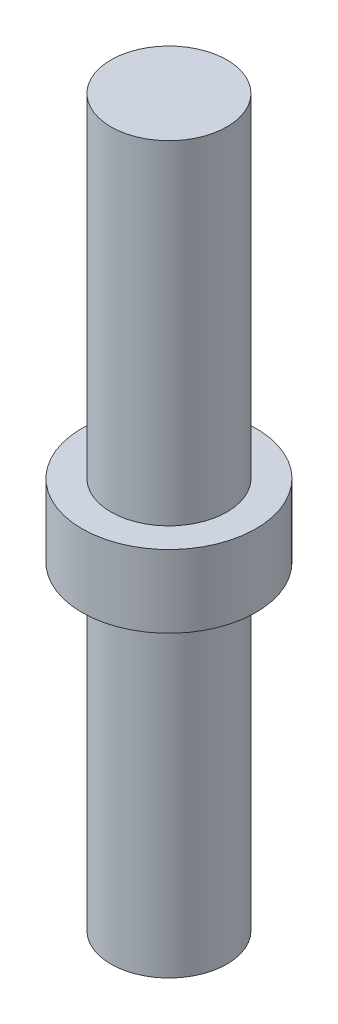
ISO-10303-21;
HEADER;
FILE_DESCRIPTION(('STEP AP214'),'2;1');
FILE_NAME('part.step','',(''),(''),'','','');
FILE_SCHEMA(('AUTOMOTIVE_DESIGN { 1 0 10303 214 1 1 1 1 }'));
ENDSEC;
DATA;
#1=APPLICATION_CONTEXT('core data for automotive mechanical design processes');
#2=APPLICATION_PROTOCOL_DEFINITION('international standard','automotive_design',2000,#1);
#3=PRODUCT_CONTEXT('',#1,'mechanical');
#4=PRODUCT('Part','Part','',(#3));
#5=PRODUCT_RELATED_PRODUCT_CATEGORY('part','',(#4));
#6=PRODUCT_DEFINITION_FORMATION('','',#4);
#7=PRODUCT_DEFINITION_CONTEXT('part definition',#1,'design');
#8=PRODUCT_DEFINITION('design','',#6,#7);
#9=PRODUCT_DEFINITION_SHAPE('','',#8);
#10=(LENGTH_UNIT() NAMED_UNIT(*) SI_UNIT(.MILLI.,.METRE.));
#11=(NAMED_UNIT(*) PLANE_ANGLE_UNIT() SI_UNIT($,.RADIAN.));
#12=(NAMED_UNIT(*) SI_UNIT($,.STERADIAN.) SOLID_ANGLE_UNIT());
#13=UNCERTAINTY_MEASURE_WITH_UNIT(LENGTH_MEASURE(1.E-05),#10,'distance_accuracy_value','');
#14=(GEOMETRIC_REPRESENTATION_CONTEXT(3) GLOBAL_UNCERTAINTY_ASSIGNED_CONTEXT((#13)) GLOBAL_UNIT_ASSIGNED_CONTEXT((#10,
#11,#12)) REPRESENTATION_CONTEXT('',''));
#15=CARTESIAN_POINT('',(0.,0.,0.));
#16=DIRECTION('',(0.,0.,1.));
#17=DIRECTION('',(1.,0.,0.));
#18=AXIS2_PLACEMENT_3D('',#15,#16,#17);
#19=CARTESIAN_POINT('',(0.,50.,0.));
#20=DIRECTION('',(0.,-1.,0.));
#21=DIRECTION('',(0.,0.,-1.));
#22=AXIS2_PLACEMENT_3D('',#19,#20,#21);
#23=CYLINDRICAL_SURFACE('',#22,4.);
#24=CARTESIAN_POINT('',(0.,0.,0.));
#25=DIRECTION('',(0.,1.,0.));
#26=DIRECTION('',(0.,0.,1.));
#27=AXIS2_PLACEMENT_3D('',#24,#25,#26);
#28=CIRCLE('',#27,4.);
#29=CARTESIAN_POINT('',(0.,0.,4.));
#30=VERTEX_POINT('',#29);
#31=EDGE_CURVE('E50',#30,#30,#28,.T.);
#32=ORIENTED_EDGE('',*,*,#31,.T.);
#33=EDGE_LOOP('',(#32));
#34=FACE_BOUND('',#33,.T.);
#35=CARTESIAN_POINT('',(0.,22.,0.));
#36=DIRECTION('',(0.,1.,0.));
#37=DIRECTION('',(0.,0.,1.));
#38=AXIS2_PLACEMENT_3D('',#35,#36,#37);
#39=CIRCLE('',#38,4.);
#40=CARTESIAN_POINT('',(0.,22.,4.));
#41=VERTEX_POINT('',#40);
#42=EDGE_CURVE('E10',#41,#41,#39,.T.);
#43=ORIENTED_EDGE('',*,*,#42,.F.);
#44=EDGE_LOOP('',(#43));
#45=FACE_BOUND('',#44,.T.);
#46=ADVANCED_FACE('F37',(#34,#45),#23,.T.);
#47=CARTESIAN_POINT('',(0.,0.,0.));
#48=DIRECTION('',(0.,1.,0.));
#49=DIRECTION('',(0.,0.,1.));
#50=AXIS2_PLACEMENT_3D('',#47,#48,#49);
#51=PLANE('',#50);
#52=ORIENTED_EDGE('',*,*,#31,.F.);
#53=EDGE_LOOP('',(#52));
#54=FACE_BOUND('',#53,.T.);
#55=ADVANCED_FACE('F79',(#54),#51,.F.);
#56=CARTESIAN_POINT('',(0.,22.,0.));
#57=DIRECTION('',(0.,1.,0.));
#58=DIRECTION('',(0.,0.,1.));
#59=AXIS2_PLACEMENT_3D('',#56,#57,#58);
#60=CYLINDRICAL_SURFACE('',#59,6.);
#61=CARTESIAN_POINT('',(0.,22.,0.));
#62=DIRECTION('',(0.,1.,0.));
#63=DIRECTION('',(0.,0.,1.));
#64=AXIS2_PLACEMENT_3D('',#61,#62,#63);
#65=CIRCLE('',#64,6.);
#66=CARTESIAN_POINT('',(0.,22.,6.));
#67=VERTEX_POINT('',#66);
#68=EDGE_CURVE('E63',#67,#67,#65,.T.);
#69=ORIENTED_EDGE('',*,*,#68,.T.);
#70=EDGE_LOOP('',(#69));
#71=FACE_BOUND('',#70,.T.);
#72=CARTESIAN_POINT('',(0.,27.,0.));
#73=DIRECTION('',(0.,1.,0.));
#74=DIRECTION('',(0.,0.,1.));
#75=AXIS2_PLACEMENT_3D('',#72,#73,#74);
#76=CIRCLE('',#75,6.);
#77=CARTESIAN_POINT('',(0.,27.,6.));
#78=VERTEX_POINT('',#77);
#79=EDGE_CURVE('E59',#78,#78,#76,.T.);
#80=ORIENTED_EDGE('',*,*,#79,.F.);
#81=EDGE_LOOP('',(#80));
#82=FACE_BOUND('',#81,.T.);
#83=ADVANCED_FACE('F76',(#71,#82),#60,.T.);
#84=CARTESIAN_POINT('',(0.,22.,0.));
#85=DIRECTION('',(0.,1.,0.));
#86=DIRECTION('',(0.,0.,1.));
#87=AXIS2_PLACEMENT_3D('',#84,#85,#86);
#88=PLANE('',#87);
#89=ORIENTED_EDGE('',*,*,#42,.T.);
#90=EDGE_LOOP('',(#89));
#91=FACE_BOUND('',#90,.T.);
#92=ORIENTED_EDGE('',*,*,#68,.F.);
#93=EDGE_LOOP('',(#92));
#94=FACE_BOUND('',#93,.T.);
#95=ADVANCED_FACE('F78',(#91,#94),#88,.F.);
#96=CARTESIAN_POINT('',(0.,27.,0.));
#97=DIRECTION('',(0.,1.,0.));
#98=DIRECTION('',(0.,0.,1.));
#99=AXIS2_PLACEMENT_3D('',#96,#97,#98);
#100=PLANE('',#99);
#101=CARTESIAN_POINT('',(0.,27.,0.));
#102=DIRECTION('',(0.,1.,0.));
#103=DIRECTION('',(0.,0.,1.));
#104=AXIS2_PLACEMENT_3D('',#101,#102,#103);
#105=CIRCLE('',#104,4.);
#106=CARTESIAN_POINT('',(0.,27.,4.));
#107=VERTEX_POINT('',#106);
#108=EDGE_CURVE('E56',#107,#107,#105,.T.);
#109=ORIENTED_EDGE('',*,*,#108,.F.);
#110=EDGE_LOOP('',(#109));
#111=FACE_BOUND('',#110,.T.);
#112=ORIENTED_EDGE('',*,*,#79,.T.);
#113=EDGE_LOOP('',(#112));
#114=FACE_BOUND('',#113,.T.);
#115=ADVANCED_FACE('F74',(#111,#114),#100,.T.);
#116=CARTESIAN_POINT('',(0.,50.,0.));
#117=DIRECTION('',(0.,1.,0.));
#118=DIRECTION('',(0.,0.,1.));
#119=AXIS2_PLACEMENT_3D('',#116,#117,#118);
#120=PLANE('',#119);
#121=CARTESIAN_POINT('',(0.,50.,0.));
#122=DIRECTION('',(0.,1.,0.));
#123=DIRECTION('',(0.,0.,1.));
#124=AXIS2_PLACEMENT_3D('',#121,#122,#123);
#125=CIRCLE('',#124,4.);
#126=CARTESIAN_POINT('',(0.,50.,4.));
#127=VERTEX_POINT('',#126);
#128=EDGE_CURVE('E45',#127,#127,#125,.T.);
#129=ORIENTED_EDGE('',*,*,#128,.T.);
#130=EDGE_LOOP('',(#129));
#131=FACE_BOUND('',#130,.T.);
#132=ADVANCED_FACE('F95',(#131),#120,.T.);
#133=ORIENTED_EDGE('',*,*,#108,.T.);
#134=EDGE_LOOP('',(#133));
#135=FACE_BOUND('',#134,.T.);
#136=ORIENTED_EDGE('',*,*,#128,.F.);
#137=EDGE_LOOP('',(#136));
#138=FACE_BOUND('',#137,.T.);
#139=ADVANCED_FACE('F39',(#135,#138),#23,.T.);
#140=CLOSED_SHELL('',(#46,#55,#83,#95,#115,#132,#139));
#141=MANIFOLD_SOLID_BREP('B2',#140);
#142=ADVANCED_BREP_SHAPE_REPRESENTATION('',(#18,#141),#14);
#143=SHAPE_DEFINITION_REPRESENTATION(#9,#142);
ENDSEC;
END-ISO-10303-21;
